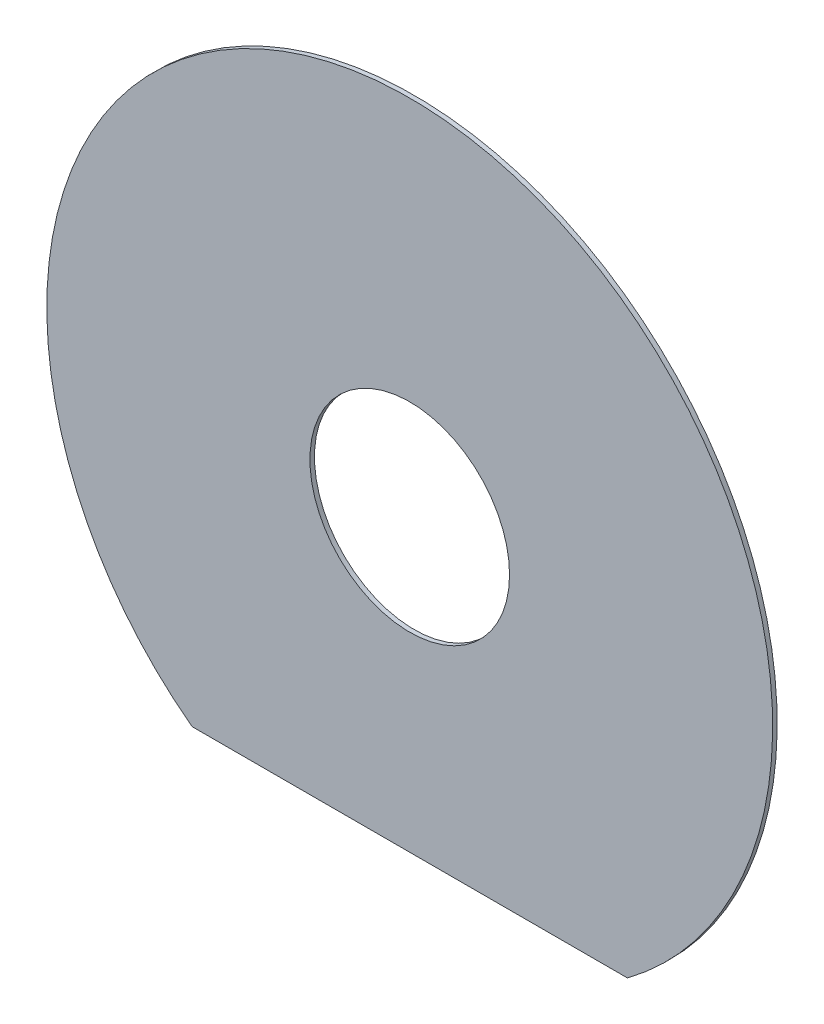
ISO-10303-21;
HEADER;
FILE_DESCRIPTION(('STEP AP214'),'2;1');
FILE_NAME('part.step','',(''),(''),'','','');
FILE_SCHEMA(('AUTOMOTIVE_DESIGN { 1 0 10303 214 1 1 1 1 }'));
ENDSEC;
DATA;
#1=APPLICATION_CONTEXT('core data for automotive mechanical design processes');
#2=APPLICATION_PROTOCOL_DEFINITION('international standard','automotive_design',2000,#1);
#3=PRODUCT_CONTEXT('',#1,'mechanical');
#4=PRODUCT('Part','Part','',(#3));
#5=PRODUCT_RELATED_PRODUCT_CATEGORY('part','',(#4));
#6=PRODUCT_DEFINITION_FORMATION('','',#4);
#7=PRODUCT_DEFINITION_CONTEXT('part definition',#1,'design');
#8=PRODUCT_DEFINITION('design','',#6,#7);
#9=PRODUCT_DEFINITION_SHAPE('','',#8);
#10=(LENGTH_UNIT() NAMED_UNIT(*) SI_UNIT(.MILLI.,.METRE.));
#11=(NAMED_UNIT(*) PLANE_ANGLE_UNIT() SI_UNIT($,.RADIAN.));
#12=(NAMED_UNIT(*) SI_UNIT($,.STERADIAN.) SOLID_ANGLE_UNIT());
#13=UNCERTAINTY_MEASURE_WITH_UNIT(LENGTH_MEASURE(1.E-05),#10,'distance_accuracy_value','');
#14=(GEOMETRIC_REPRESENTATION_CONTEXT(3) GLOBAL_UNCERTAINTY_ASSIGNED_CONTEXT((#13)) GLOBAL_UNIT_ASSIGNED_CONTEXT((#10,
#11,#12)) REPRESENTATION_CONTEXT('',''));
#15=CARTESIAN_POINT('',(0.,0.,0.));
#16=DIRECTION('',(0.,0.,1.));
#17=DIRECTION('',(1.,0.,0.));
#18=AXIS2_PLACEMENT_3D('',#15,#16,#17);
#19=CARTESIAN_POINT('',(0.,0.,3.175));
#20=DIRECTION('',(0.,0.,1.));
#21=DIRECTION('',(1.,0.,0.));
#22=AXIS2_PLACEMENT_3D('',#19,#20,#21);
#23=PLANE('',#22);
#24=CARTESIAN_POINT('',(0.,0.,3.175));
#25=DIRECTION('',(0.,0.,1.));
#26=DIRECTION('',(1.,0.,0.));
#27=AXIS2_PLACEMENT_3D('',#24,#25,#26);
#28=CIRCLE('',#27,254.);
#29=CARTESIAN_POINT('',(152.4,-203.2,3.175));
#30=VERTEX_POINT('',#29);
#31=CARTESIAN_POINT('',(-152.4,-203.2,3.175));
#32=VERTEX_POINT('',#31);
#33=EDGE_CURVE('E64',#30,#32,#28,.T.);
#34=ORIENTED_EDGE('',*,*,#33,.T.);
#35=DIRECTION('',(1.,0.,0.));
#36=VECTOR('',#35,1.);
#37=CARTESIAN_POINT('',(-152.4,-203.2,3.175));
#38=LINE('',#37,#36);
#39=EDGE_CURVE('E49',#32,#30,#38,.T.);
#40=ORIENTED_EDGE('',*,*,#39,.T.);
#41=EDGE_LOOP('',(#34,#40));
#42=FACE_BOUND('',#41,.T.);
#43=CARTESIAN_POINT('',(0.,0.,3.175));
#44=DIRECTION('',(0.,0.,1.));
#45=DIRECTION('',(1.,0.,0.));
#46=AXIS2_PLACEMENT_3D('',#43,#44,#45);
#47=CIRCLE('',#46,69.85);
#48=CARTESIAN_POINT('',(69.85,0.,3.175));
#49=VERTEX_POINT('',#48);
#50=EDGE_CURVE('E70',#49,#49,#47,.T.);
#51=ORIENTED_EDGE('',*,*,#50,.F.);
#52=EDGE_LOOP('',(#51));
#53=FACE_BOUND('',#52,.T.);
#54=ADVANCED_FACE('F33',(#42,#53),#23,.T.);
#55=CARTESIAN_POINT('',(0.,0.,0.));
#56=DIRECTION('',(0.,0.,1.));
#57=DIRECTION('',(1.,0.,0.));
#58=AXIS2_PLACEMENT_3D('',#55,#56,#57);
#59=PLANE('',#58);
#60=CARTESIAN_POINT('',(0.,0.,0.));
#61=DIRECTION('',(0.,0.,1.));
#62=DIRECTION('',(1.,0.,0.));
#63=AXIS2_PLACEMENT_3D('',#60,#61,#62);
#64=CIRCLE('',#63,254.);
#65=CARTESIAN_POINT('',(152.4,-203.2,0.));
#66=VERTEX_POINT('',#65);
#67=CARTESIAN_POINT('',(-152.4,-203.2,0.));
#68=VERTEX_POINT('',#67);
#69=EDGE_CURVE('E65',#66,#68,#64,.T.);
#70=ORIENTED_EDGE('',*,*,#69,.F.);
#71=DIRECTION('',(1.,0.,0.));
#72=VECTOR('',#71,1.);
#73=CARTESIAN_POINT('',(-152.4,-203.2,0.));
#74=LINE('',#73,#72);
#75=EDGE_CURVE('E57',#68,#66,#74,.T.);
#76=ORIENTED_EDGE('',*,*,#75,.F.);
#77=EDGE_LOOP('',(#70,#76));
#78=FACE_BOUND('',#77,.T.);
#79=CARTESIAN_POINT('',(0.,0.,0.));
#80=DIRECTION('',(0.,0.,1.));
#81=DIRECTION('',(1.,0.,0.));
#82=AXIS2_PLACEMENT_3D('',#79,#80,#81);
#83=CIRCLE('',#82,69.85);
#84=CARTESIAN_POINT('',(69.85,0.,0.));
#85=VERTEX_POINT('',#84);
#86=EDGE_CURVE('E73',#85,#85,#83,.T.);
#87=ORIENTED_EDGE('',*,*,#86,.T.);
#88=EDGE_LOOP('',(#87));
#89=FACE_BOUND('',#88,.T.);
#90=ADVANCED_FACE('F68',(#78,#89),#59,.F.);
#91=CARTESIAN_POINT('',(0.,0.,3.175));
#92=DIRECTION('',(0.,0.,-1.));
#93=DIRECTION('',(-1.,0.,0.));
#94=AXIS2_PLACEMENT_3D('',#91,#92,#93);
#95=CYLINDRICAL_SURFACE('',#94,254.);
#96=ORIENTED_EDGE('',*,*,#69,.T.);
#97=DIRECTION('',(0.,0.,-1.));
#98=VECTOR('',#97,1.);
#99=CARTESIAN_POINT('',(-152.4,-203.2,3.175));
#100=LINE('',#99,#98);
#101=EDGE_CURVE('E11',#32,#68,#100,.T.);
#102=ORIENTED_EDGE('',*,*,#101,.F.);
#103=ORIENTED_EDGE('',*,*,#33,.F.);
#104=DIRECTION('',(0.,0.,-1.));
#105=VECTOR('',#104,1.);
#106=CARTESIAN_POINT('',(152.4,-203.2,3.175));
#107=LINE('',#106,#105);
#108=EDGE_CURVE('E42',#30,#66,#107,.T.);
#109=ORIENTED_EDGE('',*,*,#108,.T.);
#110=EDGE_LOOP('',(#96,#102,#103,#109));
#111=FACE_BOUND('',#110,.T.);
#112=ADVANCED_FACE('F35',(#111),#95,.T.);
#113=CARTESIAN_POINT('',(-152.4,-203.2,3.175));
#114=DIRECTION('',(0.,1.,0.));
#115=DIRECTION('',(0.,0.,1.));
#116=AXIS2_PLACEMENT_3D('',#113,#114,#115);
#117=PLANE('',#116);
#118=ORIENTED_EDGE('',*,*,#75,.T.);
#119=ORIENTED_EDGE('',*,*,#108,.F.);
#120=ORIENTED_EDGE('',*,*,#39,.F.);
#121=ORIENTED_EDGE('',*,*,#101,.T.);
#122=EDGE_LOOP('',(#118,#119,#120,#121));
#123=FACE_BOUND('',#122,.T.);
#124=ADVANCED_FACE('F60',(#123),#117,.F.);
#125=CARTESIAN_POINT('',(0.,0.,3.175));
#126=DIRECTION('',(0.,0.,-1.));
#127=DIRECTION('',(-1.,0.,0.));
#128=AXIS2_PLACEMENT_3D('',#125,#126,#127);
#129=CYLINDRICAL_SURFACE('',#128,69.85);
#130=ORIENTED_EDGE('',*,*,#50,.T.);
#131=EDGE_LOOP('',(#130));
#132=FACE_BOUND('',#131,.T.);
#133=ORIENTED_EDGE('',*,*,#86,.F.);
#134=EDGE_LOOP('',(#133));
#135=FACE_BOUND('',#134,.T.);
#136=ADVANCED_FACE('F81',(#132,#135),#129,.F.);
#137=CLOSED_SHELL('',(#54,#90,#112,#124,#136));
#138=MANIFOLD_SOLID_BREP('B2',#137);
#139=ADVANCED_BREP_SHAPE_REPRESENTATION('',(#18,#138),#14);
#140=SHAPE_DEFINITION_REPRESENTATION(#9,#139);
ENDSEC;
END-ISO-10303-21;
